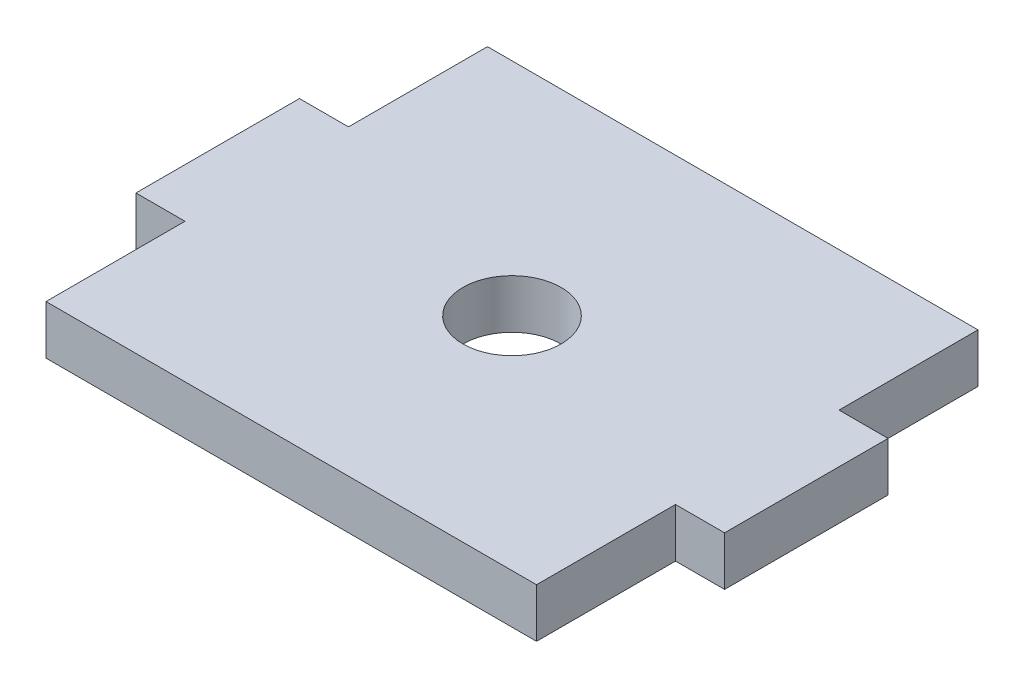
ISO-10303-21;
HEADER;
FILE_DESCRIPTION(('STEP AP214'),'2;1');
FILE_NAME('part.step','',(''),(''),'','','');
FILE_SCHEMA(('AUTOMOTIVE_DESIGN { 1 0 10303 214 1 1 1 1 }'));
ENDSEC;
DATA;
#1=APPLICATION_CONTEXT('core data for automotive mechanical design processes');
#2=APPLICATION_PROTOCOL_DEFINITION('international standard','automotive_design',2000,#1);
#3=PRODUCT_CONTEXT('',#1,'mechanical');
#4=PRODUCT('Part','Part','',(#3));
#5=PRODUCT_RELATED_PRODUCT_CATEGORY('part','',(#4));
#6=PRODUCT_DEFINITION_FORMATION('','',#4);
#7=PRODUCT_DEFINITION_CONTEXT('part definition',#1,'design');
#8=PRODUCT_DEFINITION('design','',#6,#7);
#9=PRODUCT_DEFINITION_SHAPE('','',#8);
#10=(LENGTH_UNIT() NAMED_UNIT(*) SI_UNIT(.MILLI.,.METRE.));
#11=(NAMED_UNIT(*) PLANE_ANGLE_UNIT() SI_UNIT($,.RADIAN.));
#12=(NAMED_UNIT(*) SI_UNIT($,.STERADIAN.) SOLID_ANGLE_UNIT());
#13=UNCERTAINTY_MEASURE_WITH_UNIT(LENGTH_MEASURE(1.E-05),#10,'distance_accuracy_value','');
#14=(GEOMETRIC_REPRESENTATION_CONTEXT(3) GLOBAL_UNCERTAINTY_ASSIGNED_CONTEXT((#13)) GLOBAL_UNIT_ASSIGNED_CONTEXT((#10,
#11,#12)) REPRESENTATION_CONTEXT('',''));
#15=CARTESIAN_POINT('',(0.,0.,0.));
#16=DIRECTION('',(0.,0.,1.));
#17=DIRECTION('',(1.,0.,0.));
#18=AXIS2_PLACEMENT_3D('',#15,#16,#17);
#19=CARTESIAN_POINT('',(0.,3.,0.));
#20=DIRECTION('',(0.,-1.,0.));
#21=DIRECTION('',(0.,0.,-1.));
#22=AXIS2_PLACEMENT_3D('',#19,#20,#21);
#23=PLANE('',#22);
#24=DIRECTION('',(0.,0.,1.));
#25=VECTOR('',#24,1.);
#26=CARTESIAN_POINT('',(0.,3.,0.));
#27=LINE('',#26,#25);
#28=CARTESIAN_POINT('',(0.,3.,-8.5));
#29=VERTEX_POINT('',#28);
#30=CARTESIAN_POINT('',(0.,3.,0.));
#31=VERTEX_POINT('',#30);
#32=EDGE_CURVE('E177',#29,#31,#27,.T.);
#33=ORIENTED_EDGE('',*,*,#32,.T.);
#34=DIRECTION('',(1.,0.,0.));
#35=VECTOR('',#34,1.);
#36=CARTESIAN_POINT('',(0.,3.,0.));
#37=LINE('',#36,#35);
#38=CARTESIAN_POINT('',(30.,3.,0.));
#39=VERTEX_POINT('',#38);
#40=EDGE_CURVE('E103',#31,#39,#37,.T.);
#41=ORIENTED_EDGE('',*,*,#40,.T.);
#42=DIRECTION('',(0.,0.,-1.));
#43=VECTOR('',#42,1.);
#44=CARTESIAN_POINT('',(30.,3.,-8.49999999999999));
#45=LINE('',#44,#43);
#46=CARTESIAN_POINT('',(30.,3.,-8.49999999999999));
#47=VERTEX_POINT('',#46);
#48=EDGE_CURVE('E204',#39,#47,#45,.T.);
#49=ORIENTED_EDGE('',*,*,#48,.T.);
#50=DIRECTION('',(1.,0.,0.));
#51=VECTOR('',#50,1.);
#52=CARTESIAN_POINT('',(33.,3.,-8.49999999999999));
#53=LINE('',#52,#51);
#54=CARTESIAN_POINT('',(33.,3.,-8.49999999999999));
#55=VERTEX_POINT('',#54);
#56=EDGE_CURVE('E222',#47,#55,#53,.T.);
#57=ORIENTED_EDGE('',*,*,#56,.T.);
#58=DIRECTION('',(0.,0.,-1.));
#59=VECTOR('',#58,1.);
#60=CARTESIAN_POINT('',(33.,3.,-13.5));
#61=LINE('',#60,#59);
#62=CARTESIAN_POINT('',(33.,3.,-18.5));
#63=VERTEX_POINT('',#62);
#64=EDGE_CURVE('E219',#55,#63,#61,.T.);
#65=ORIENTED_EDGE('',*,*,#64,.T.);
#66=DIRECTION('',(-1.,0.,0.));
#67=VECTOR('',#66,1.);
#68=CARTESIAN_POINT('',(33.,3.,-18.5));
#69=LINE('',#68,#67);
#70=CARTESIAN_POINT('',(30.,3.,-18.5));
#71=VERTEX_POINT('',#70);
#72=EDGE_CURVE('E221',#63,#71,#69,.T.);
#73=ORIENTED_EDGE('',*,*,#72,.T.);
#74=DIRECTION('',(0.,0.,-1.));
#75=VECTOR('',#74,1.);
#76=CARTESIAN_POINT('',(30.,3.,-27.));
#77=LINE('',#76,#75);
#78=CARTESIAN_POINT('',(30.,3.,-27.));
#79=VERTEX_POINT('',#78);
#80=EDGE_CURVE('E224',#71,#79,#77,.T.);
#81=ORIENTED_EDGE('',*,*,#80,.T.);
#82=DIRECTION('',(-1.,0.,0.));
#83=VECTOR('',#82,1.);
#84=CARTESIAN_POINT('',(0.,3.,-27.));
#85=LINE('',#84,#83);
#86=CARTESIAN_POINT('',(0.,3.,-27.));
#87=VERTEX_POINT('',#86);
#88=EDGE_CURVE('E230',#79,#87,#85,.T.);
#89=ORIENTED_EDGE('',*,*,#88,.T.);
#90=DIRECTION('',(0.,0.,1.));
#91=VECTOR('',#90,1.);
#92=CARTESIAN_POINT('',(0.,3.,-18.5));
#93=LINE('',#92,#91);
#94=CARTESIAN_POINT('',(0.,3.,-18.5));
#95=VERTEX_POINT('',#94);
#96=EDGE_CURVE('E134',#87,#95,#93,.T.);
#97=ORIENTED_EDGE('',*,*,#96,.T.);
#98=DIRECTION('',(-1.,0.,0.));
#99=VECTOR('',#98,1.);
#100=CARTESIAN_POINT('',(-3.,3.,-18.5));
#101=LINE('',#100,#99);
#102=CARTESIAN_POINT('',(-3.,3.,-18.5));
#103=VERTEX_POINT('',#102);
#104=EDGE_CURVE('E128',#95,#103,#101,.T.);
#105=ORIENTED_EDGE('',*,*,#104,.T.);
#106=DIRECTION('',(0.,0.,1.));
#107=VECTOR('',#106,1.);
#108=CARTESIAN_POINT('',(-3.,3.,-13.5));
#109=LINE('',#108,#107);
#110=CARTESIAN_POINT('',(-3.,3.,-8.5));
#111=VERTEX_POINT('',#110);
#112=EDGE_CURVE('E132',#103,#111,#109,.T.);
#113=ORIENTED_EDGE('',*,*,#112,.T.);
#114=DIRECTION('',(1.,0.,0.));
#115=VECTOR('',#114,1.);
#116=CARTESIAN_POINT('',(-3.,3.,-8.5));
#117=LINE('',#116,#115);
#118=EDGE_CURVE('E49',#111,#29,#117,.T.);
#119=ORIENTED_EDGE('',*,*,#118,.T.);
#120=EDGE_LOOP('',(#33,#41,#49,#57,#65,#73,#81,#89,#97,#105,#113,#119));
#121=FACE_BOUND('',#120,.T.);
#122=CARTESIAN_POINT('',(15.,3.,-13.5));
#123=DIRECTION('',(0.,1.,0.));
#124=DIRECTION('',(0.,0.,1.));
#125=AXIS2_PLACEMENT_3D('',#122,#123,#124);
#126=CIRCLE('',#125,3.);
#127=CARTESIAN_POINT('',(15.,3.,-10.5));
#128=VERTEX_POINT('',#127);
#129=EDGE_CURVE('E157',#128,#128,#126,.T.);
#130=ORIENTED_EDGE('',*,*,#129,.F.);
#131=EDGE_LOOP('',(#130));
#132=FACE_BOUND('',#131,.T.);
#133=ADVANCED_FACE('F32',(#121,#132),#23,.F.);
#134=CARTESIAN_POINT('',(0.,0.,0.));
#135=DIRECTION('',(0.,-1.,0.));
#136=DIRECTION('',(0.,0.,-1.));
#137=AXIS2_PLACEMENT_3D('',#134,#135,#136);
#138=PLANE('',#137);
#139=DIRECTION('',(0.,0.,1.));
#140=VECTOR('',#139,1.);
#141=CARTESIAN_POINT('',(0.,0.,0.));
#142=LINE('',#141,#140);
#143=CARTESIAN_POINT('',(0.,0.,-8.5));
#144=VERTEX_POINT('',#143);
#145=CARTESIAN_POINT('',(0.,0.,0.));
#146=VERTEX_POINT('',#145);
#147=EDGE_CURVE('E153',#144,#146,#142,.T.);
#148=ORIENTED_EDGE('',*,*,#147,.F.);
#149=DIRECTION('',(1.,0.,0.));
#150=VECTOR('',#149,1.);
#151=CARTESIAN_POINT('',(-3.,0.,-8.5));
#152=LINE('',#151,#150);
#153=CARTESIAN_POINT('',(-3.,0.,-8.5));
#154=VERTEX_POINT('',#153);
#155=EDGE_CURVE('E95',#154,#144,#152,.T.);
#156=ORIENTED_EDGE('',*,*,#155,.F.);
#157=DIRECTION('',(0.,0.,1.));
#158=VECTOR('',#157,1.);
#159=CARTESIAN_POINT('',(-3.,0.,-13.5));
#160=LINE('',#159,#158);
#161=CARTESIAN_POINT('',(-3.,0.,-18.5));
#162=VERTEX_POINT('',#161);
#163=EDGE_CURVE('E89',#162,#154,#160,.T.);
#164=ORIENTED_EDGE('',*,*,#163,.F.);
#165=DIRECTION('',(-1.,0.,0.));
#166=VECTOR('',#165,1.);
#167=CARTESIAN_POINT('',(-3.,0.,-18.5));
#168=LINE('',#167,#166);
#169=CARTESIAN_POINT('',(0.,0.,-18.5));
#170=VERTEX_POINT('',#169);
#171=EDGE_CURVE('E143',#170,#162,#168,.T.);
#172=ORIENTED_EDGE('',*,*,#171,.F.);
#173=DIRECTION('',(0.,0.,1.));
#174=VECTOR('',#173,1.);
#175=CARTESIAN_POINT('',(0.,0.,-18.5));
#176=LINE('',#175,#174);
#177=CARTESIAN_POINT('',(0.,0.,-27.));
#178=VERTEX_POINT('',#177);
#179=EDGE_CURVE('E172',#178,#170,#176,.T.);
#180=ORIENTED_EDGE('',*,*,#179,.F.);
#181=DIRECTION('',(-1.,0.,0.));
#182=VECTOR('',#181,1.);
#183=CARTESIAN_POINT('',(0.,0.,-27.));
#184=LINE('',#183,#182);
#185=CARTESIAN_POINT('',(30.,0.,-27.));
#186=VERTEX_POINT('',#185);
#187=EDGE_CURVE('E170',#186,#178,#184,.T.);
#188=ORIENTED_EDGE('',*,*,#187,.F.);
#189=DIRECTION('',(0.,0.,-1.));
#190=VECTOR('',#189,1.);
#191=CARTESIAN_POINT('',(30.,0.,-27.));
#192=LINE('',#191,#190);
#193=CARTESIAN_POINT('',(30.,0.,-18.5));
#194=VERTEX_POINT('',#193);
#195=EDGE_CURVE('E168',#194,#186,#192,.T.);
#196=ORIENTED_EDGE('',*,*,#195,.F.);
#197=DIRECTION('',(-1.,0.,0.));
#198=VECTOR('',#197,1.);
#199=CARTESIAN_POINT('',(33.,0.,-18.5));
#200=LINE('',#199,#198);
#201=CARTESIAN_POINT('',(33.,0.,-18.5));
#202=VERTEX_POINT('',#201);
#203=EDGE_CURVE('E166',#202,#194,#200,.T.);
#204=ORIENTED_EDGE('',*,*,#203,.F.);
#205=DIRECTION('',(0.,0.,-1.));
#206=VECTOR('',#205,1.);
#207=CARTESIAN_POINT('',(33.,0.,-13.5));
#208=LINE('',#207,#206);
#209=CARTESIAN_POINT('',(33.,0.,-8.49999999999999));
#210=VERTEX_POINT('',#209);
#211=EDGE_CURVE('E164',#210,#202,#208,.T.);
#212=ORIENTED_EDGE('',*,*,#211,.F.);
#213=DIRECTION('',(1.,0.,0.));
#214=VECTOR('',#213,1.);
#215=CARTESIAN_POINT('',(33.,0.,-8.49999999999999));
#216=LINE('',#215,#214);
#217=CARTESIAN_POINT('',(30.,0.,-8.49999999999999));
#218=VERTEX_POINT('',#217);
#219=EDGE_CURVE('E161',#218,#210,#216,.T.);
#220=ORIENTED_EDGE('',*,*,#219,.F.);
#221=DIRECTION('',(0.,0.,-1.));
#222=VECTOR('',#221,1.);
#223=CARTESIAN_POINT('',(30.,0.,-8.49999999999999));
#224=LINE('',#223,#222);
#225=CARTESIAN_POINT('',(30.,0.,0.));
#226=VERTEX_POINT('',#225);
#227=EDGE_CURVE('E159',#226,#218,#224,.T.);
#228=ORIENTED_EDGE('',*,*,#227,.F.);
#229=DIRECTION('',(1.,0.,0.));
#230=VECTOR('',#229,1.);
#231=CARTESIAN_POINT('',(0.,0.,0.));
#232=LINE('',#231,#230);
#233=EDGE_CURVE('E156',#146,#226,#232,.T.);
#234=ORIENTED_EDGE('',*,*,#233,.F.);
#235=EDGE_LOOP('',(#148,#156,#164,#172,#180,#188,#196,#204,#212,#220,#228,#234));
#236=FACE_BOUND('',#235,.T.);
#237=CARTESIAN_POINT('',(15.,0.,-13.5));
#238=DIRECTION('',(0.,1.,0.));
#239=DIRECTION('',(0.,0.,1.));
#240=AXIS2_PLACEMENT_3D('',#237,#238,#239);
#241=CIRCLE('',#240,3.);
#242=CARTESIAN_POINT('',(15.,0.,-10.5));
#243=VERTEX_POINT('',#242);
#244=EDGE_CURVE('E383',#243,#243,#241,.T.);
#245=ORIENTED_EDGE('',*,*,#244,.T.);
#246=EDGE_LOOP('',(#245));
#247=FACE_BOUND('',#246,.T.);
#248=ADVANCED_FACE('F208',(#236,#247),#138,.T.);
#249=CARTESIAN_POINT('',(0.,3.,0.));
#250=DIRECTION('',(1.,0.,0.));
#251=DIRECTION('',(0.,0.,-1.));
#252=AXIS2_PLACEMENT_3D('',#249,#250,#251);
#253=PLANE('',#252);
#254=ORIENTED_EDGE('',*,*,#147,.T.);
#255=DIRECTION('',(0.,-1.,0.));
#256=VECTOR('',#255,1.);
#257=CARTESIAN_POINT('',(0.,3.,0.));
#258=LINE('',#257,#256);
#259=EDGE_CURVE('E11',#31,#146,#258,.T.);
#260=ORIENTED_EDGE('',*,*,#259,.F.);
#261=ORIENTED_EDGE('',*,*,#32,.F.);
#262=DIRECTION('',(0.,-1.,0.));
#263=VECTOR('',#262,1.);
#264=CARTESIAN_POINT('',(0.,3.,-8.5));
#265=LINE('',#264,#263);
#266=EDGE_CURVE('E149',#29,#144,#265,.T.);
#267=ORIENTED_EDGE('',*,*,#266,.T.);
#268=EDGE_LOOP('',(#254,#260,#261,#267));
#269=FACE_BOUND('',#268,.T.);
#270=ADVANCED_FACE('F34',(#269),#253,.F.);
#271=CARTESIAN_POINT('',(0.,3.,0.));
#272=DIRECTION('',(0.,0.,-1.));
#273=DIRECTION('',(-1.,0.,0.));
#274=AXIS2_PLACEMENT_3D('',#271,#272,#273);
#275=PLANE('',#274);
#276=ORIENTED_EDGE('',*,*,#233,.T.);
#277=DIRECTION('',(0.,-1.,0.));
#278=VECTOR('',#277,1.);
#279=CARTESIAN_POINT('',(30.,3.,0.));
#280=LINE('',#279,#278);
#281=EDGE_CURVE('E41',#39,#226,#280,.T.);
#282=ORIENTED_EDGE('',*,*,#281,.F.);
#283=ORIENTED_EDGE('',*,*,#40,.F.);
#284=ORIENTED_EDGE('',*,*,#259,.T.);
#285=EDGE_LOOP('',(#276,#282,#283,#284));
#286=FACE_BOUND('',#285,.T.);
#287=ADVANCED_FACE('F264',(#286),#275,.F.);
#288=CARTESIAN_POINT('',(30.,3.,-8.49999999999999));
#289=DIRECTION('',(-1.,0.,0.));
#290=DIRECTION('',(0.,0.,1.));
#291=AXIS2_PLACEMENT_3D('',#288,#289,#290);
#292=PLANE('',#291);
#293=ORIENTED_EDGE('',*,*,#227,.T.);
#294=DIRECTION('',(0.,-1.,0.));
#295=VECTOR('',#294,1.);
#296=CARTESIAN_POINT('',(30.,3.,-8.49999999999999));
#297=LINE('',#296,#295);
#298=EDGE_CURVE('E196',#47,#218,#297,.T.);
#299=ORIENTED_EDGE('',*,*,#298,.F.);
#300=ORIENTED_EDGE('',*,*,#48,.F.);
#301=ORIENTED_EDGE('',*,*,#281,.T.);
#302=EDGE_LOOP('',(#293,#299,#300,#301));
#303=FACE_BOUND('',#302,.T.);
#304=ADVANCED_FACE('F202',(#303),#292,.F.);
#305=CARTESIAN_POINT('',(33.,3.,-8.49999999999999));
#306=DIRECTION('',(0.,0.,-1.));
#307=DIRECTION('',(-1.,0.,0.));
#308=AXIS2_PLACEMENT_3D('',#305,#306,#307);
#309=PLANE('',#308);
#310=ORIENTED_EDGE('',*,*,#219,.T.);
#311=DIRECTION('',(0.,-1.,0.));
#312=VECTOR('',#311,1.);
#313=CARTESIAN_POINT('',(33.,3.,-8.49999999999999));
#314=LINE('',#313,#312);
#315=EDGE_CURVE('E193',#55,#210,#314,.T.);
#316=ORIENTED_EDGE('',*,*,#315,.F.);
#317=ORIENTED_EDGE('',*,*,#56,.F.);
#318=ORIENTED_EDGE('',*,*,#298,.T.);
#319=EDGE_LOOP('',(#310,#316,#317,#318));
#320=FACE_BOUND('',#319,.T.);
#321=ADVANCED_FACE('F213',(#320),#309,.F.);
#322=CARTESIAN_POINT('',(33.,3.,-13.5));
#323=DIRECTION('',(-1.,0.,0.));
#324=DIRECTION('',(0.,0.,1.));
#325=AXIS2_PLACEMENT_3D('',#322,#323,#324);
#326=PLANE('',#325);
#327=ORIENTED_EDGE('',*,*,#211,.T.);
#328=DIRECTION('',(0.,-1.,0.));
#329=VECTOR('',#328,1.);
#330=CARTESIAN_POINT('',(33.,3.,-18.5));
#331=LINE('',#330,#329);
#332=EDGE_CURVE('E190',#63,#202,#331,.T.);
#333=ORIENTED_EDGE('',*,*,#332,.F.);
#334=ORIENTED_EDGE('',*,*,#64,.F.);
#335=ORIENTED_EDGE('',*,*,#315,.T.);
#336=EDGE_LOOP('',(#327,#333,#334,#335));
#337=FACE_BOUND('',#336,.T.);
#338=ADVANCED_FACE('F217',(#337),#326,.F.);
#339=CARTESIAN_POINT('',(33.,3.,-18.5));
#340=DIRECTION('',(0.,0.,1.));
#341=DIRECTION('',(1.,0.,0.));
#342=AXIS2_PLACEMENT_3D('',#339,#340,#341);
#343=PLANE('',#342);
#344=ORIENTED_EDGE('',*,*,#203,.T.);
#345=DIRECTION('',(0.,-1.,0.));
#346=VECTOR('',#345,1.);
#347=CARTESIAN_POINT('',(30.,3.,-18.5));
#348=LINE('',#347,#346);
#349=EDGE_CURVE('E187',#71,#194,#348,.T.);
#350=ORIENTED_EDGE('',*,*,#349,.F.);
#351=ORIENTED_EDGE('',*,*,#72,.F.);
#352=ORIENTED_EDGE('',*,*,#332,.T.);
#353=EDGE_LOOP('',(#344,#350,#351,#352));
#354=FACE_BOUND('',#353,.T.);
#355=ADVANCED_FACE('F277',(#354),#343,.F.);
#356=CARTESIAN_POINT('',(30.,3.,-27.));
#357=DIRECTION('',(-1.,0.,0.));
#358=DIRECTION('',(0.,0.,1.));
#359=AXIS2_PLACEMENT_3D('',#356,#357,#358);
#360=PLANE('',#359);
#361=ORIENTED_EDGE('',*,*,#195,.T.);
#362=DIRECTION('',(0.,-1.,0.));
#363=VECTOR('',#362,1.);
#364=CARTESIAN_POINT('',(30.,3.,-27.));
#365=LINE('',#364,#363);
#366=EDGE_CURVE('E184',#79,#186,#365,.T.);
#367=ORIENTED_EDGE('',*,*,#366,.F.);
#368=ORIENTED_EDGE('',*,*,#80,.F.);
#369=ORIENTED_EDGE('',*,*,#349,.T.);
#370=EDGE_LOOP('',(#361,#367,#368,#369));
#371=FACE_BOUND('',#370,.T.);
#372=ADVANCED_FACE('F280',(#371),#360,.F.);
#373=CARTESIAN_POINT('',(0.,3.,-27.));
#374=DIRECTION('',(0.,0.,1.));
#375=DIRECTION('',(1.,0.,0.));
#376=AXIS2_PLACEMENT_3D('',#373,#374,#375);
#377=PLANE('',#376);
#378=ORIENTED_EDGE('',*,*,#187,.T.);
#379=DIRECTION('',(0.,-1.,0.));
#380=VECTOR('',#379,1.);
#381=CARTESIAN_POINT('',(0.,3.,-27.));
#382=LINE('',#381,#380);
#383=EDGE_CURVE('E181',#87,#178,#382,.T.);
#384=ORIENTED_EDGE('',*,*,#383,.F.);
#385=ORIENTED_EDGE('',*,*,#88,.F.);
#386=ORIENTED_EDGE('',*,*,#366,.T.);
#387=EDGE_LOOP('',(#378,#384,#385,#386));
#388=FACE_BOUND('',#387,.T.);
#389=ADVANCED_FACE('F236',(#388),#377,.F.);
#390=CARTESIAN_POINT('',(0.,3.,-18.5));
#391=DIRECTION('',(1.,0.,0.));
#392=DIRECTION('',(0.,0.,-1.));
#393=AXIS2_PLACEMENT_3D('',#390,#391,#392);
#394=PLANE('',#393);
#395=ORIENTED_EDGE('',*,*,#179,.T.);
#396=DIRECTION('',(0.,-1.,0.));
#397=VECTOR('',#396,1.);
#398=CARTESIAN_POINT('',(0.,3.,-18.5));
#399=LINE('',#398,#397);
#400=EDGE_CURVE('E144',#95,#170,#399,.T.);
#401=ORIENTED_EDGE('',*,*,#400,.F.);
#402=ORIENTED_EDGE('',*,*,#96,.F.);
#403=ORIENTED_EDGE('',*,*,#383,.T.);
#404=EDGE_LOOP('',(#395,#401,#402,#403));
#405=FACE_BOUND('',#404,.T.);
#406=ADVANCED_FACE('F240',(#405),#394,.F.);
#407=CARTESIAN_POINT('',(-3.,3.,-18.5));
#408=DIRECTION('',(0.,0.,1.));
#409=DIRECTION('',(1.,0.,0.));
#410=AXIS2_PLACEMENT_3D('',#407,#408,#409);
#411=PLANE('',#410);
#412=ORIENTED_EDGE('',*,*,#171,.T.);
#413=DIRECTION('',(0.,-1.,0.));
#414=VECTOR('',#413,1.);
#415=CARTESIAN_POINT('',(-3.,3.,-18.5));
#416=LINE('',#415,#414);
#417=EDGE_CURVE('E140',#103,#162,#416,.T.);
#418=ORIENTED_EDGE('',*,*,#417,.F.);
#419=ORIENTED_EDGE('',*,*,#104,.F.);
#420=ORIENTED_EDGE('',*,*,#400,.T.);
#421=EDGE_LOOP('',(#412,#418,#419,#420));
#422=FACE_BOUND('',#421,.T.);
#423=ADVANCED_FACE('F141',(#422),#411,.F.);
#424=CARTESIAN_POINT('',(-3.,3.,-13.5));
#425=DIRECTION('',(1.,0.,0.));
#426=DIRECTION('',(0.,0.,-1.));
#427=AXIS2_PLACEMENT_3D('',#424,#425,#426);
#428=PLANE('',#427);
#429=ORIENTED_EDGE('',*,*,#163,.T.);
#430=DIRECTION('',(0.,-1.,0.));
#431=VECTOR('',#430,1.);
#432=CARTESIAN_POINT('',(-3.,3.,-8.5));
#433=LINE('',#432,#431);
#434=EDGE_CURVE('E145',#111,#154,#433,.T.);
#435=ORIENTED_EDGE('',*,*,#434,.F.);
#436=ORIENTED_EDGE('',*,*,#112,.F.);
#437=ORIENTED_EDGE('',*,*,#417,.T.);
#438=EDGE_LOOP('',(#429,#435,#436,#437));
#439=FACE_BOUND('',#438,.T.);
#440=ADVANCED_FACE('F147',(#439),#428,.F.);
#441=CARTESIAN_POINT('',(-3.,3.,-8.5));
#442=DIRECTION('',(0.,0.,-1.));
#443=DIRECTION('',(-1.,0.,0.));
#444=AXIS2_PLACEMENT_3D('',#441,#442,#443);
#445=PLANE('',#444);
#446=ORIENTED_EDGE('',*,*,#155,.T.);
#447=ORIENTED_EDGE('',*,*,#266,.F.);
#448=ORIENTED_EDGE('',*,*,#118,.F.);
#449=ORIENTED_EDGE('',*,*,#434,.T.);
#450=EDGE_LOOP('',(#446,#447,#448,#449));
#451=FACE_BOUND('',#450,.T.);
#452=ADVANCED_FACE('F244',(#451),#445,.F.);
#453=CARTESIAN_POINT('',(15.,3.,-13.5));
#454=DIRECTION('',(0.,-1.,0.));
#455=DIRECTION('',(0.,0.,-1.));
#456=AXIS2_PLACEMENT_3D('',#453,#454,#455);
#457=CYLINDRICAL_SURFACE('',#456,3.);
#458=ORIENTED_EDGE('',*,*,#129,.T.);
#459=EDGE_LOOP('',(#458));
#460=FACE_BOUND('',#459,.T.);
#461=ORIENTED_EDGE('',*,*,#244,.F.);
#462=EDGE_LOOP('',(#461));
#463=FACE_BOUND('',#462,.T.);
#464=ADVANCED_FACE('F246',(#460,#463),#457,.F.);
#465=CLOSED_SHELL('',(#133,#248,#270,#287,#304,#321,#338,#355,#372,#389,#406,#423,#440,#452,#464));
#466=MANIFOLD_SOLID_BREP('B2',#465);
#467=ADVANCED_BREP_SHAPE_REPRESENTATION('',(#18,#466),#14);
#468=SHAPE_DEFINITION_REPRESENTATION(#9,#467);
ENDSEC;
END-ISO-10303-21;
